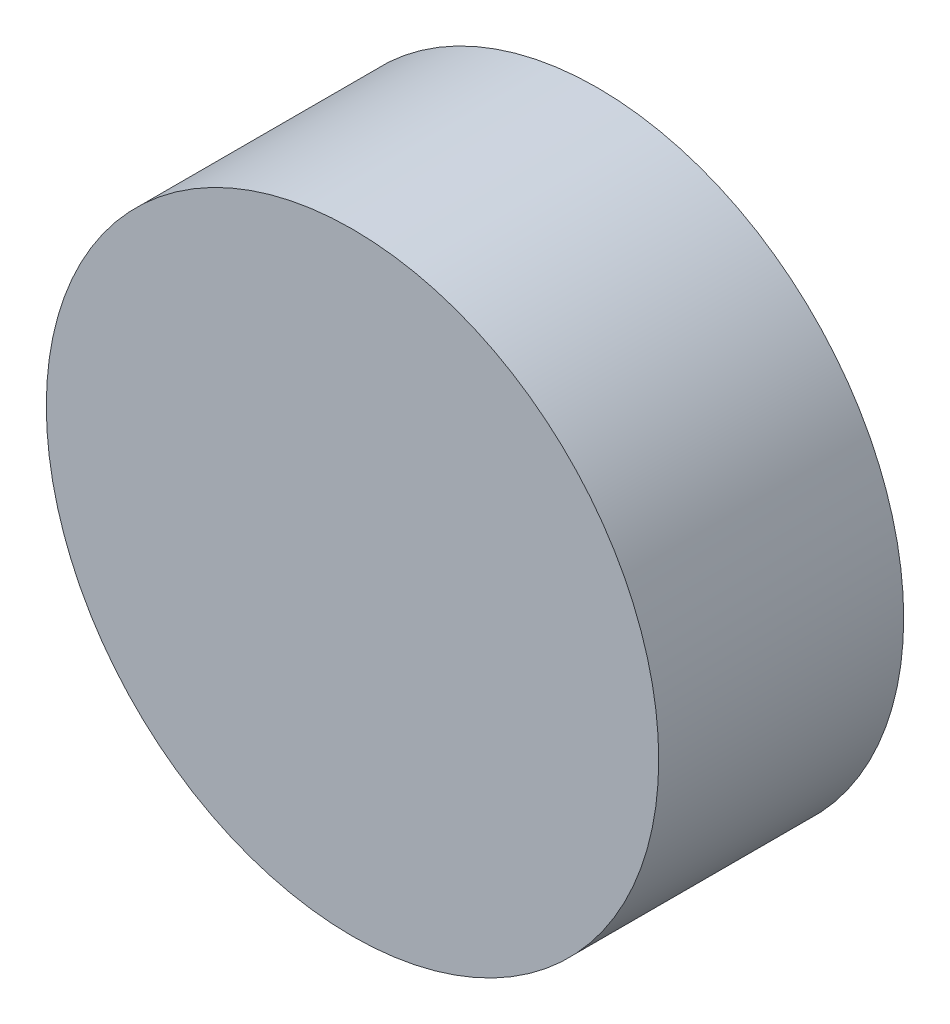
ISO-10303-21;
HEADER;
FILE_DESCRIPTION(('STEP AP214'),'2;1');
FILE_NAME('part.step','',(''),(''),'','','');
FILE_SCHEMA(('AUTOMOTIVE_DESIGN { 1 0 10303 214 1 1 1 1 }'));
ENDSEC;
DATA;
#1=APPLICATION_CONTEXT('core data for automotive mechanical design processes');
#2=APPLICATION_PROTOCOL_DEFINITION('international standard','automotive_design',2000,#1);
#3=PRODUCT_CONTEXT('',#1,'mechanical');
#4=PRODUCT('Part','Part','',(#3));
#5=PRODUCT_RELATED_PRODUCT_CATEGORY('part','',(#4));
#6=PRODUCT_DEFINITION_FORMATION('','',#4);
#7=PRODUCT_DEFINITION_CONTEXT('part definition',#1,'design');
#8=PRODUCT_DEFINITION('design','',#6,#7);
#9=PRODUCT_DEFINITION_SHAPE('','',#8);
#10=(LENGTH_UNIT() NAMED_UNIT(*) SI_UNIT(.MILLI.,.METRE.));
#11=(NAMED_UNIT(*) PLANE_ANGLE_UNIT() SI_UNIT($,.RADIAN.));
#12=(NAMED_UNIT(*) SI_UNIT($,.STERADIAN.) SOLID_ANGLE_UNIT());
#13=UNCERTAINTY_MEASURE_WITH_UNIT(LENGTH_MEASURE(1.E-05),#10,'distance_accuracy_value','');
#14=(GEOMETRIC_REPRESENTATION_CONTEXT(3) GLOBAL_UNCERTAINTY_ASSIGNED_CONTEXT((#13)) GLOBAL_UNIT_ASSIGNED_CONTEXT((#10,
#11,#12)) REPRESENTATION_CONTEXT('',''));
#15=CARTESIAN_POINT('',(0.,0.,0.));
#16=DIRECTION('',(0.,0.,1.));
#17=DIRECTION('',(1.,0.,0.));
#18=AXIS2_PLACEMENT_3D('',#15,#16,#17);
#19=CARTESIAN_POINT('',(0.,0.,2.));
#20=DIRECTION('',(0.,0.,-1.));
#21=DIRECTION('',(-1.,0.,0.));
#22=AXIS2_PLACEMENT_3D('',#19,#20,#21);
#23=CYLINDRICAL_SURFACE('',#22,2.5);
#24=CARTESIAN_POINT('',(0.,0.,2.));
#25=DIRECTION('',(0.,0.,1.));
#26=DIRECTION('',(1.,0.,0.));
#27=AXIS2_PLACEMENT_3D('',#24,#25,#26);
#28=CIRCLE('',#27,2.5);
#29=CARTESIAN_POINT('',(2.5,0.,2.));
#30=VERTEX_POINT('',#29);
#31=EDGE_CURVE('E10',#30,#30,#28,.T.);
#32=ORIENTED_EDGE('',*,*,#31,.F.);
#33=EDGE_LOOP('',(#32));
#34=FACE_BOUND('',#33,.T.);
#35=CARTESIAN_POINT('',(0.,0.,0.));
#36=DIRECTION('',(0.,0.,1.));
#37=DIRECTION('',(1.,0.,0.));
#38=AXIS2_PLACEMENT_3D('',#35,#36,#37);
#39=CIRCLE('',#38,2.5);
#40=CARTESIAN_POINT('',(2.5,0.,0.));
#41=VERTEX_POINT('',#40);
#42=EDGE_CURVE('E44',#41,#41,#39,.T.);
#43=ORIENTED_EDGE('',*,*,#42,.T.);
#44=EDGE_LOOP('',(#43));
#45=FACE_BOUND('',#44,.T.);
#46=ADVANCED_FACE('F41',(#34,#45),#23,.T.);
#47=CARTESIAN_POINT('',(0.,0.,2.));
#48=DIRECTION('',(0.,0.,1.));
#49=DIRECTION('',(1.,0.,0.));
#50=AXIS2_PLACEMENT_3D('',#47,#48,#49);
#51=PLANE('',#50);
#52=ORIENTED_EDGE('',*,*,#31,.T.);
#53=EDGE_LOOP('',(#52));
#54=FACE_BOUND('',#53,.T.);
#55=ADVANCED_FACE('F56',(#54),#51,.T.);
#56=CARTESIAN_POINT('',(0.,0.,0.));
#57=DIRECTION('',(0.,0.,1.));
#58=DIRECTION('',(1.,0.,0.));
#59=AXIS2_PLACEMENT_3D('',#56,#57,#58);
#60=PLANE('',#59);
#61=ORIENTED_EDGE('',*,*,#42,.F.);
#62=EDGE_LOOP('',(#61));
#63=FACE_BOUND('',#62,.T.);
#64=ADVANCED_FACE('F54',(#63),#60,.F.);
#65=CLOSED_SHELL('',(#46,#55,#64));
#66=MANIFOLD_SOLID_BREP('B2',#65);
#67=ADVANCED_BREP_SHAPE_REPRESENTATION('',(#18,#66),#14);
#68=SHAPE_DEFINITION_REPRESENTATION(#9,#67);
ENDSEC;
END-ISO-10303-21;
